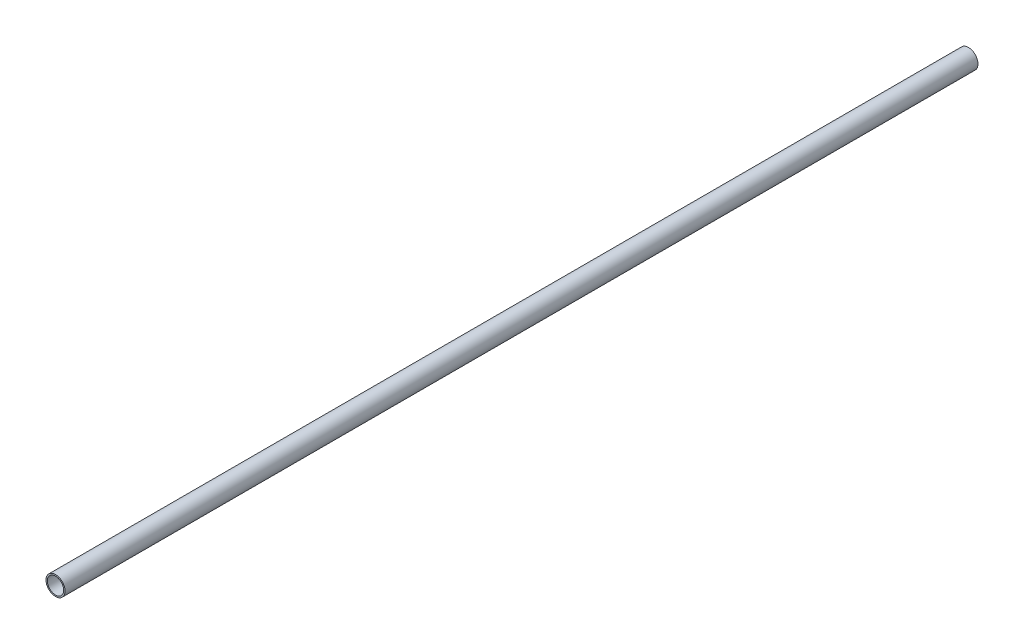
ISO-10303-21;
HEADER;
FILE_DESCRIPTION(('STEP AP214'),'2;1');
FILE_NAME('part.step','',(''),(''),'','','');
FILE_SCHEMA(('AUTOMOTIVE_DESIGN { 1 0 10303 214 1 1 1 1 }'));
ENDSEC;
DATA;
#1=APPLICATION_CONTEXT('core data for automotive mechanical design processes');
#2=APPLICATION_PROTOCOL_DEFINITION('international standard','automotive_design',2000,#1);
#3=PRODUCT_CONTEXT('',#1,'mechanical');
#4=PRODUCT('Part','Part','',(#3));
#5=PRODUCT_RELATED_PRODUCT_CATEGORY('part','',(#4));
#6=PRODUCT_DEFINITION_FORMATION('','',#4);
#7=PRODUCT_DEFINITION_CONTEXT('part definition',#1,'design');
#8=PRODUCT_DEFINITION('design','',#6,#7);
#9=PRODUCT_DEFINITION_SHAPE('','',#8);
#10=(LENGTH_UNIT() NAMED_UNIT(*) SI_UNIT(.MILLI.,.METRE.));
#11=(NAMED_UNIT(*) PLANE_ANGLE_UNIT() SI_UNIT($,.RADIAN.));
#12=(NAMED_UNIT(*) SI_UNIT($,.STERADIAN.) SOLID_ANGLE_UNIT());
#13=UNCERTAINTY_MEASURE_WITH_UNIT(LENGTH_MEASURE(1.E-05),#10,'distance_accuracy_value','');
#14=(GEOMETRIC_REPRESENTATION_CONTEXT(3) GLOBAL_UNCERTAINTY_ASSIGNED_CONTEXT((#13)) GLOBAL_UNIT_ASSIGNED_CONTEXT((#10,
#11,#12)) REPRESENTATION_CONTEXT('',''));
#15=CARTESIAN_POINT('',(0.,0.,0.));
#16=DIRECTION('',(0.,0.,1.));
#17=DIRECTION('',(1.,0.,0.));
#18=AXIS2_PLACEMENT_3D('',#15,#16,#17);
#19=CARTESIAN_POINT('',(0.,0.,-335.28));
#20=DIRECTION('',(0.,0.,1.));
#21=DIRECTION('',(1.,0.,0.));
#22=AXIS2_PLACEMENT_3D('',#19,#20,#21);
#23=CYLINDRICAL_SURFACE('',#22,7.);
#24=CARTESIAN_POINT('',(0.,0.,-335.28));
#25=DIRECTION('',(0.,0.,1.));
#26=DIRECTION('',(1.,0.,0.));
#27=AXIS2_PLACEMENT_3D('',#24,#25,#26);
#28=CIRCLE('',#27,7.);
#29=CARTESIAN_POINT('',(7.,0.,-335.28));
#30=VERTEX_POINT('',#29);
#31=EDGE_CURVE('E10',#30,#30,#28,.T.);
#32=ORIENTED_EDGE('',*,*,#31,.T.);
#33=EDGE_LOOP('',(#32));
#34=FACE_BOUND('',#33,.T.);
#35=CARTESIAN_POINT('',(0.,0.,335.28));
#36=DIRECTION('',(0.,0.,1.));
#37=DIRECTION('',(1.,0.,0.));
#38=AXIS2_PLACEMENT_3D('',#35,#36,#37);
#39=CIRCLE('',#38,7.);
#40=CARTESIAN_POINT('',(7.,0.,335.28));
#41=VERTEX_POINT('',#40);
#42=EDGE_CURVE('E49',#41,#41,#39,.T.);
#43=ORIENTED_EDGE('',*,*,#42,.F.);
#44=EDGE_LOOP('',(#43));
#45=FACE_BOUND('',#44,.T.);
#46=ADVANCED_FACE('F37',(#34,#45),#23,.T.);
#47=CARTESIAN_POINT('',(0.,0.,-335.28));
#48=DIRECTION('',(0.,0.,1.));
#49=DIRECTION('',(1.,0.,0.));
#50=AXIS2_PLACEMENT_3D('',#47,#48,#49);
#51=PLANE('',#50);
#52=CARTESIAN_POINT('',(0.,0.,-335.28));
#53=DIRECTION('',(0.,0.,1.));
#54=DIRECTION('',(1.,0.,0.));
#55=AXIS2_PLACEMENT_3D('',#52,#53,#54);
#56=CIRCLE('',#55,6.);
#57=CARTESIAN_POINT('',(6.,0.,-335.28));
#58=VERTEX_POINT('',#57);
#59=EDGE_CURVE('E44',#58,#58,#56,.T.);
#60=ORIENTED_EDGE('',*,*,#59,.T.);
#61=EDGE_LOOP('',(#60));
#62=FACE_BOUND('',#61,.T.);
#63=ORIENTED_EDGE('',*,*,#31,.F.);
#64=EDGE_LOOP('',(#63));
#65=FACE_BOUND('',#64,.T.);
#66=ADVANCED_FACE('F70',(#62,#65),#51,.F.);
#67=CARTESIAN_POINT('',(0.,0.,-335.28));
#68=DIRECTION('',(0.,0.,1.));
#69=DIRECTION('',(1.,0.,0.));
#70=AXIS2_PLACEMENT_3D('',#67,#68,#69);
#71=CYLINDRICAL_SURFACE('',#70,6.);
#72=ORIENTED_EDGE('',*,*,#59,.F.);
#73=EDGE_LOOP('',(#72));
#74=FACE_BOUND('',#73,.T.);
#75=CARTESIAN_POINT('',(0.,0.,335.28));
#76=DIRECTION('',(0.,0.,1.));
#77=DIRECTION('',(1.,0.,0.));
#78=AXIS2_PLACEMENT_3D('',#75,#76,#77);
#79=CIRCLE('',#78,6.);
#80=CARTESIAN_POINT('',(6.,0.,335.28));
#81=VERTEX_POINT('',#80);
#82=EDGE_CURVE('E54',#81,#81,#79,.T.);
#83=ORIENTED_EDGE('',*,*,#82,.T.);
#84=EDGE_LOOP('',(#83));
#85=FACE_BOUND('',#84,.T.);
#86=ADVANCED_FACE('F61',(#74,#85),#71,.F.);
#87=CARTESIAN_POINT('',(0.,0.,335.28));
#88=DIRECTION('',(0.,0.,1.));
#89=DIRECTION('',(1.,0.,0.));
#90=AXIS2_PLACEMENT_3D('',#87,#88,#89);
#91=PLANE('',#90);
#92=ORIENTED_EDGE('',*,*,#42,.T.);
#93=EDGE_LOOP('',(#92));
#94=FACE_BOUND('',#93,.T.);
#95=ORIENTED_EDGE('',*,*,#82,.F.);
#96=EDGE_LOOP('',(#95));
#97=FACE_BOUND('',#96,.T.);
#98=ADVANCED_FACE('F63',(#94,#97),#91,.T.);
#99=CLOSED_SHELL('',(#46,#66,#86,#98));
#100=MANIFOLD_SOLID_BREP('B2',#99);
#101=ADVANCED_BREP_SHAPE_REPRESENTATION('',(#18,#100),#14);
#102=SHAPE_DEFINITION_REPRESENTATION(#9,#101);
ENDSEC;
END-ISO-10303-21;
